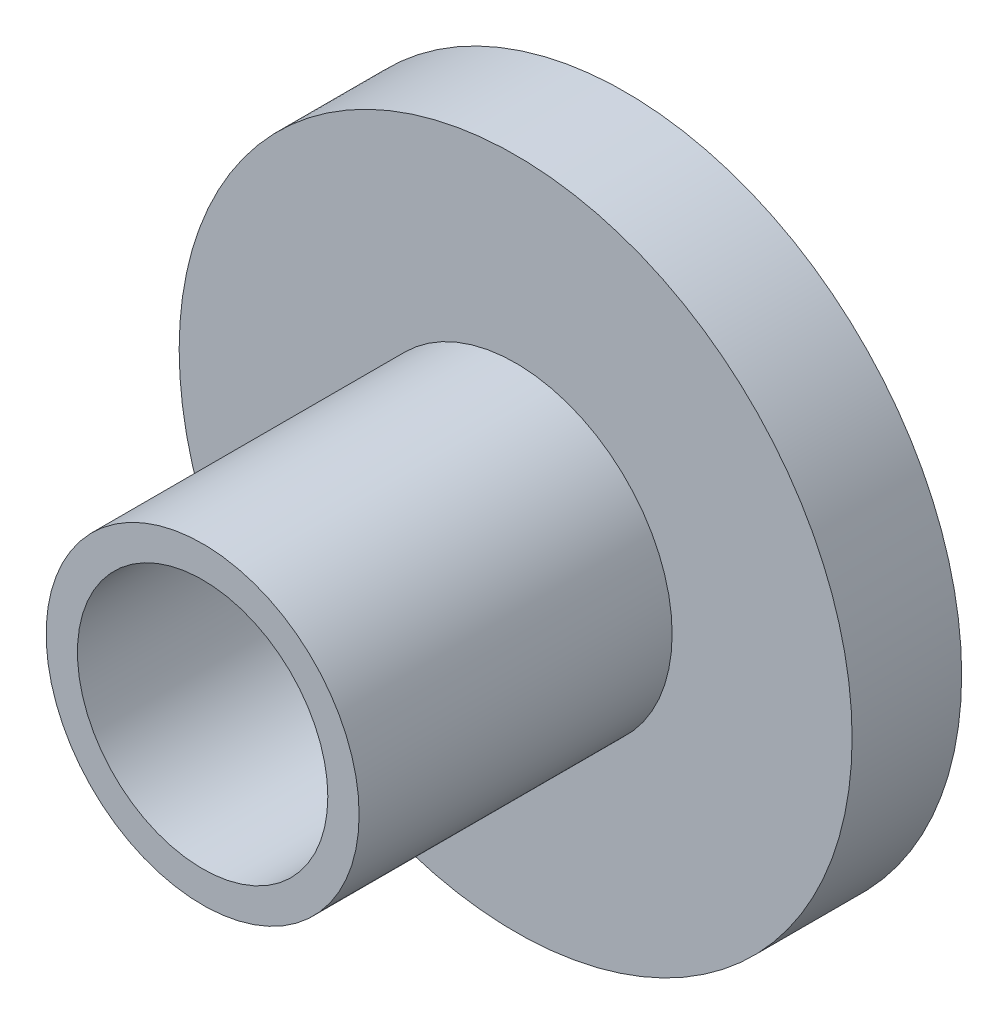
ISO-10303-21;
HEADER;
FILE_DESCRIPTION(('STEP AP214'),'2;1');
FILE_NAME('part.step','',(''),(''),'','','');
FILE_SCHEMA(('AUTOMOTIVE_DESIGN { 1 0 10303 214 1 1 1 1 }'));
ENDSEC;
DATA;
#1=APPLICATION_CONTEXT('core data for automotive mechanical design processes');
#2=APPLICATION_PROTOCOL_DEFINITION('international standard','automotive_design',2000,#1);
#3=PRODUCT_CONTEXT('',#1,'mechanical');
#4=PRODUCT('Part','Part','',(#3));
#5=PRODUCT_RELATED_PRODUCT_CATEGORY('part','',(#4));
#6=PRODUCT_DEFINITION_FORMATION('','',#4);
#7=PRODUCT_DEFINITION_CONTEXT('part definition',#1,'design');
#8=PRODUCT_DEFINITION('design','',#6,#7);
#9=PRODUCT_DEFINITION_SHAPE('','',#8);
#10=(LENGTH_UNIT() NAMED_UNIT(*) SI_UNIT(.MILLI.,.METRE.));
#11=(NAMED_UNIT(*) PLANE_ANGLE_UNIT() SI_UNIT($,.RADIAN.));
#12=(NAMED_UNIT(*) SI_UNIT($,.STERADIAN.) SOLID_ANGLE_UNIT());
#13=UNCERTAINTY_MEASURE_WITH_UNIT(LENGTH_MEASURE(1.E-05),#10,'distance_accuracy_value','');
#14=(GEOMETRIC_REPRESENTATION_CONTEXT(3) GLOBAL_UNCERTAINTY_ASSIGNED_CONTEXT((#13)) GLOBAL_UNIT_ASSIGNED_CONTEXT((#10,
#11,#12)) REPRESENTATION_CONTEXT('',''));
#15=CARTESIAN_POINT('',(0.,0.,0.));
#16=DIRECTION('',(0.,0.,1.));
#17=DIRECTION('',(1.,0.,0.));
#18=AXIS2_PLACEMENT_3D('',#15,#16,#17);
#19=CARTESIAN_POINT('',(0.,0.,3.5));
#20=DIRECTION('',(0.,0.,-1.));
#21=DIRECTION('',(-1.,0.,0.));
#22=AXIS2_PLACEMENT_3D('',#19,#20,#21);
#23=CYLINDRICAL_SURFACE('',#22,10.75);
#24=CARTESIAN_POINT('',(0.,0.,3.5));
#25=DIRECTION('',(0.,0.,1.));
#26=DIRECTION('',(1.,0.,0.));
#27=AXIS2_PLACEMENT_3D('',#24,#25,#26);
#28=CIRCLE('',#27,10.75);
#29=CARTESIAN_POINT('',(10.75,0.,3.5));
#30=VERTEX_POINT('',#29);
#31=EDGE_CURVE('E10',#30,#30,#28,.T.);
#32=ORIENTED_EDGE('',*,*,#31,.F.);
#33=EDGE_LOOP('',(#32));
#34=FACE_BOUND('',#33,.T.);
#35=CARTESIAN_POINT('',(0.,0.,0.));
#36=DIRECTION('',(0.,0.,1.));
#37=DIRECTION('',(1.,0.,0.));
#38=AXIS2_PLACEMENT_3D('',#35,#36,#37);
#39=CIRCLE('',#38,10.75);
#40=CARTESIAN_POINT('',(10.75,0.,0.));
#41=VERTEX_POINT('',#40);
#42=EDGE_CURVE('E34',#41,#41,#39,.T.);
#43=ORIENTED_EDGE('',*,*,#42,.T.);
#44=EDGE_LOOP('',(#43));
#45=FACE_BOUND('',#44,.T.);
#46=ADVANCED_FACE('F31',(#34,#45),#23,.T.);
#47=CARTESIAN_POINT('',(0.,0.,3.5));
#48=DIRECTION('',(0.,0.,1.));
#49=DIRECTION('',(1.,0.,0.));
#50=AXIS2_PLACEMENT_3D('',#47,#48,#49);
#51=PLANE('',#50);
#52=CARTESIAN_POINT('',(0.,0.,3.5));
#53=DIRECTION('',(0.,0.,1.));
#54=DIRECTION('',(1.,0.,0.));
#55=AXIS2_PLACEMENT_3D('',#52,#53,#54);
#56=CIRCLE('',#55,5.);
#57=CARTESIAN_POINT('',(5.,0.,3.5));
#58=VERTEX_POINT('',#57);
#59=EDGE_CURVE('E43',#58,#58,#56,.T.);
#60=ORIENTED_EDGE('',*,*,#59,.F.);
#61=EDGE_LOOP('',(#60));
#62=FACE_BOUND('',#61,.T.);
#63=ORIENTED_EDGE('',*,*,#31,.T.);
#64=EDGE_LOOP('',(#63));
#65=FACE_BOUND('',#64,.T.);
#66=ADVANCED_FACE('F71',(#62,#65),#51,.T.);
#67=CARTESIAN_POINT('',(0.,0.,0.));
#68=DIRECTION('',(0.,0.,1.));
#69=DIRECTION('',(1.,0.,0.));
#70=AXIS2_PLACEMENT_3D('',#67,#68,#69);
#71=PLANE('',#70);
#72=CARTESIAN_POINT('',(0.,0.,0.));
#73=DIRECTION('',(0.,0.,1.));
#74=DIRECTION('',(1.,0.,0.));
#75=AXIS2_PLACEMENT_3D('',#72,#73,#74);
#76=CIRCLE('',#75,4.);
#77=CARTESIAN_POINT('',(4.,0.,0.));
#78=VERTEX_POINT('',#77);
#79=EDGE_CURVE('E46',#78,#78,#76,.F.);
#80=ORIENTED_EDGE('',*,*,#79,.F.);
#81=EDGE_LOOP('',(#80));
#82=FACE_BOUND('',#81,.T.);
#83=ORIENTED_EDGE('',*,*,#42,.F.);
#84=EDGE_LOOP('',(#83));
#85=FACE_BOUND('',#84,.T.);
#86=ADVANCED_FACE('F67',(#82,#85),#71,.F.);
#87=CARTESIAN_POINT('',(0.,0.,13.5));
#88=DIRECTION('',(0.,0.,-1.));
#89=DIRECTION('',(-1.,0.,0.));
#90=AXIS2_PLACEMENT_3D('',#87,#88,#89);
#91=CYLINDRICAL_SURFACE('',#90,5.);
#92=CARTESIAN_POINT('',(0.,0.,13.5));
#93=DIRECTION('',(0.,0.,1.));
#94=DIRECTION('',(1.,0.,0.));
#95=AXIS2_PLACEMENT_3D('',#92,#93,#94);
#96=CIRCLE('',#95,5.);
#97=CARTESIAN_POINT('',(5.,0.,13.5));
#98=VERTEX_POINT('',#97);
#99=EDGE_CURVE('E41',#98,#98,#96,.T.);
#100=ORIENTED_EDGE('',*,*,#99,.F.);
#101=EDGE_LOOP('',(#100));
#102=FACE_BOUND('',#101,.T.);
#103=ORIENTED_EDGE('',*,*,#59,.T.);
#104=EDGE_LOOP('',(#103));
#105=FACE_BOUND('',#104,.T.);
#106=ADVANCED_FACE('F61',(#102,#105),#91,.T.);
#107=CARTESIAN_POINT('',(0.,0.,13.5));
#108=DIRECTION('',(0.,0.,1.));
#109=DIRECTION('',(1.,0.,0.));
#110=AXIS2_PLACEMENT_3D('',#107,#108,#109);
#111=PLANE('',#110);
#112=CARTESIAN_POINT('',(0.,0.,13.5));
#113=DIRECTION('',(0.,0.,1.));
#114=DIRECTION('',(1.,0.,0.));
#115=AXIS2_PLACEMENT_3D('',#112,#113,#114);
#116=CIRCLE('',#115,4.);
#117=CARTESIAN_POINT('',(4.,0.,13.5));
#118=VERTEX_POINT('',#117);
#119=EDGE_CURVE('E51',#118,#118,#116,.T.);
#120=ORIENTED_EDGE('',*,*,#119,.F.);
#121=EDGE_LOOP('',(#120));
#122=FACE_BOUND('',#121,.T.);
#123=ORIENTED_EDGE('',*,*,#99,.T.);
#124=EDGE_LOOP('',(#123));
#125=FACE_BOUND('',#124,.T.);
#126=ADVANCED_FACE('F58',(#122,#125),#111,.T.);
#127=CARTESIAN_POINT('',(0.,0.,-0.000999999999999265));
#128=DIRECTION('',(0.,0.,1.));
#129=DIRECTION('',(1.,0.,0.));
#130=AXIS2_PLACEMENT_3D('',#127,#128,#129);
#131=CYLINDRICAL_SURFACE('',#130,4.);
#132=CARTESIAN_POINT('',(4.,0.,13.5));
#133=CARTESIAN_POINT('',(4.,0.,13.359375));
#134=CARTESIAN_POINT('',(4.,0.,13.21875));
#135=CARTESIAN_POINT('',(4.,0.,12.9375));
#136=CARTESIAN_POINT('',(4.,0.,12.796875));
#137=CARTESIAN_POINT('',(4.,0.,12.515625));
#138=CARTESIAN_POINT('',(4.,0.,12.375));
#139=CARTESIAN_POINT('',(4.,0.,12.09375));
#140=CARTESIAN_POINT('',(4.,0.,11.953125));
#141=CARTESIAN_POINT('',(4.,0.,11.671875));
#142=CARTESIAN_POINT('',(4.,0.,11.53125));
#143=CARTESIAN_POINT('',(4.,0.,11.25));
#144=CARTESIAN_POINT('',(4.,0.,11.109375));
#145=CARTESIAN_POINT('',(4.,0.,10.828125));
#146=CARTESIAN_POINT('',(4.,0.,10.6875));
#147=CARTESIAN_POINT('',(4.,0.,10.40625));
#148=CARTESIAN_POINT('',(4.,0.,10.265625));
#149=CARTESIAN_POINT('',(4.,0.,9.984375));
#150=CARTESIAN_POINT('',(4.,0.,9.84375));
#151=CARTESIAN_POINT('',(4.,0.,9.5625));
#152=CARTESIAN_POINT('',(4.,0.,9.421875));
#153=CARTESIAN_POINT('',(4.,0.,9.140625));
#154=CARTESIAN_POINT('',(4.,0.,9.));
#155=CARTESIAN_POINT('',(4.,0.,8.71875));
#156=CARTESIAN_POINT('',(4.,0.,8.578125));
#157=CARTESIAN_POINT('',(4.,0.,8.296875));
#158=CARTESIAN_POINT('',(4.,0.,8.15625));
#159=CARTESIAN_POINT('',(4.,0.,7.875));
#160=CARTESIAN_POINT('',(4.,0.,7.734375));
#161=CARTESIAN_POINT('',(4.,0.,7.453125));
#162=CARTESIAN_POINT('',(4.,0.,7.3125));
#163=CARTESIAN_POINT('',(4.,0.,7.03125));
#164=CARTESIAN_POINT('',(4.,0.,6.890625));
#165=CARTESIAN_POINT('',(4.,0.,6.609375));
#166=CARTESIAN_POINT('',(4.,0.,6.46875));
#167=CARTESIAN_POINT('',(4.,0.,6.1875));
#168=CARTESIAN_POINT('',(4.,0.,6.046875));
#169=CARTESIAN_POINT('',(4.,0.,5.765625));
#170=CARTESIAN_POINT('',(4.,0.,5.625));
#171=CARTESIAN_POINT('',(4.,0.,5.34375));
#172=CARTESIAN_POINT('',(4.,0.,5.203125));
#173=CARTESIAN_POINT('',(4.,0.,4.921875));
#174=CARTESIAN_POINT('',(4.,0.,4.78125));
#175=CARTESIAN_POINT('',(4.,0.,4.5));
#176=CARTESIAN_POINT('',(4.,0.,4.359375));
#177=CARTESIAN_POINT('',(4.,0.,4.078125));
#178=CARTESIAN_POINT('',(4.,0.,3.9375));
#179=CARTESIAN_POINT('',(4.,0.,3.65625));
#180=CARTESIAN_POINT('',(4.,0.,3.515625));
#181=CARTESIAN_POINT('',(4.,0.,3.234375));
#182=CARTESIAN_POINT('',(4.,0.,3.09375));
#183=CARTESIAN_POINT('',(4.,0.,2.8125));
#184=CARTESIAN_POINT('',(4.,0.,2.671875));
#185=CARTESIAN_POINT('',(4.,0.,2.390625));
#186=CARTESIAN_POINT('',(4.,0.,2.25));
#187=CARTESIAN_POINT('',(4.,0.,1.96875));
#188=CARTESIAN_POINT('',(4.,0.,1.828125));
#189=CARTESIAN_POINT('',(4.,0.,1.546875));
#190=CARTESIAN_POINT('',(4.,0.,1.40625));
#191=CARTESIAN_POINT('',(4.,0.,1.125));
#192=CARTESIAN_POINT('',(4.,0.,0.984375));
#193=CARTESIAN_POINT('',(4.,0.,0.703125000000001));
#194=CARTESIAN_POINT('',(4.,0.,0.5625));
#195=CARTESIAN_POINT('',(4.,0.,0.28125));
#196=CARTESIAN_POINT('',(4.,0.,0.140625));
#197=CARTESIAN_POINT('',(4.,0.,0.));
#198=B_SPLINE_CURVE_WITH_KNOTS('',3,(#132,#133,#134,#135,#136,#137,#138,#139,#140,#141,#142,
#143,#144,#145,#146,#147,#148,#149,#150,#151,#152,#153,#154,#155,#156,#157,#158,#159,#160,#161,
#162,#163,#164,#165,#166,#167,#168,#169,#170,#171,#172,#173,#174,#175,#176,#177,#178,#179,#180,
#181,#182,#183,#184,#185,#186,#187,#188,#189,#190,#191,#192,#193,#194,#195,#196,#197),
.UNSPECIFIED.,.F.,.F.,(4,2,2,2,2,2,2,2,2,2,2,2,2,2,2,2,2,2,2,2,2,2,2,2,2,2,2,2,2,2,2,2,4),(0.,
0.421875,0.843750000000001,1.265625,1.6875,2.109375,2.53125,2.953125,3.375,3.796875,4.21875,
4.640625,5.0625,5.484375,5.90625,6.328125,6.75,7.171875,7.59375,8.015625,8.4375,8.859375,
9.28125,9.703125,10.125,10.546875,10.96875,11.390625,11.8125,12.234375,12.65625,13.078125,13.5),.UNSPECIFIED.);
#199=EDGE_CURVE('BSEAM55',#118,#78,#198,.T.);
#200=ORIENTED_EDGE('',*,*,#119,.T.);
#201=ORIENTED_EDGE('',*,*,#79,.T.);
#202=ORIENTED_EDGE('',*,*,#199,.T.);
#203=ORIENTED_EDGE('',*,*,#199,.F.);
#204=EDGE_LOOP('',(#200,#202,#201,#203));
#205=FACE_BOUND('',#204,.T.);
#206=ADVANCED_FACE('F55',(#205),#131,.F.);
#207=CLOSED_SHELL('',(#46,#66,#86,#106,#126,#206));
#208=MANIFOLD_SOLID_BREP('B2',#207);
#209=ADVANCED_BREP_SHAPE_REPRESENTATION('',(#18,#208),#14);
#210=SHAPE_DEFINITION_REPRESENTATION(#9,#209);
ENDSEC;
END-ISO-10303-21;
